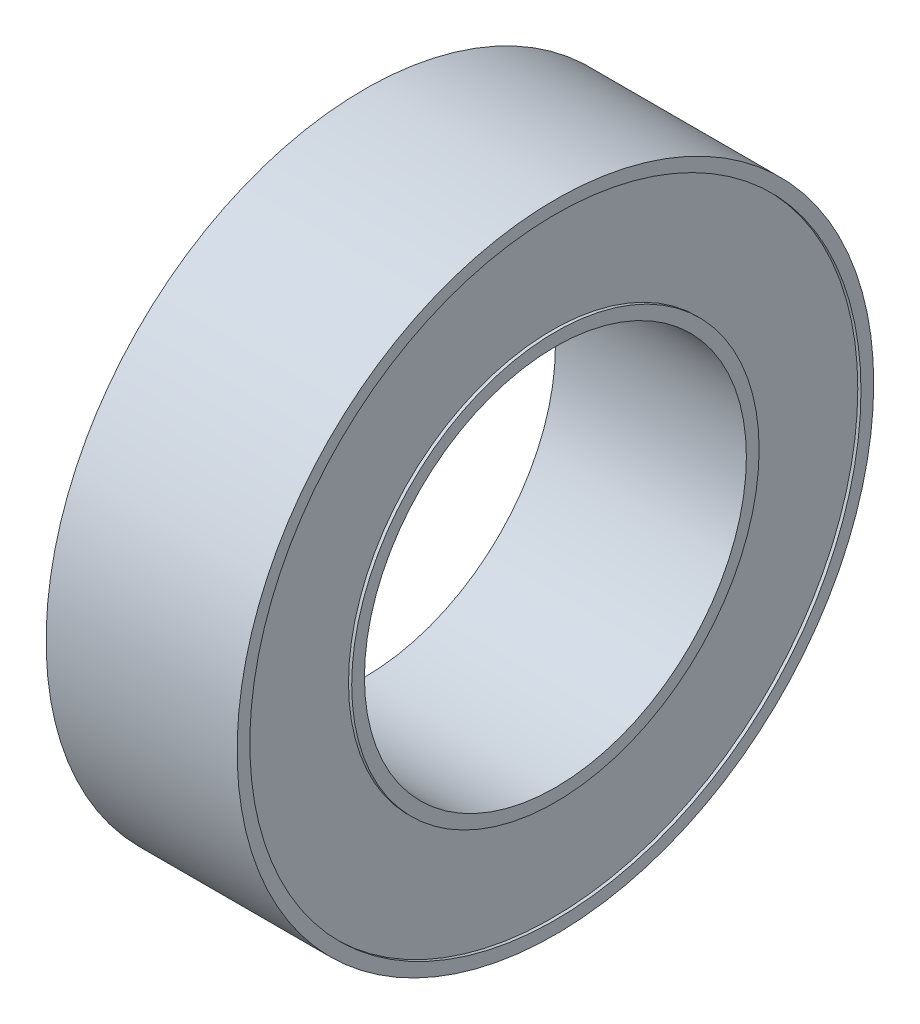
ISO-10303-21;
HEADER;
FILE_DESCRIPTION(('STEP AP214'),'2;1');
FILE_NAME('part.step','',(''),(''),'','','');
FILE_SCHEMA(('AUTOMOTIVE_DESIGN { 1 0 10303 214 1 1 1 1 }'));
ENDSEC;
DATA;
#1=APPLICATION_CONTEXT('core data for automotive mechanical design processes');
#2=APPLICATION_PROTOCOL_DEFINITION('international standard','automotive_design',2000,#1);
#3=PRODUCT_CONTEXT('',#1,'mechanical');
#4=PRODUCT('Part','Part','',(#3));
#5=PRODUCT_RELATED_PRODUCT_CATEGORY('part','',(#4));
#6=PRODUCT_DEFINITION_FORMATION('','',#4);
#7=PRODUCT_DEFINITION_CONTEXT('part definition',#1,'design');
#8=PRODUCT_DEFINITION('design','',#6,#7);
#9=PRODUCT_DEFINITION_SHAPE('','',#8);
#10=(LENGTH_UNIT() NAMED_UNIT(*) SI_UNIT(.MILLI.,.METRE.));
#11=(NAMED_UNIT(*) PLANE_ANGLE_UNIT() SI_UNIT($,.RADIAN.));
#12=(NAMED_UNIT(*) SI_UNIT($,.STERADIAN.) SOLID_ANGLE_UNIT());
#13=UNCERTAINTY_MEASURE_WITH_UNIT(LENGTH_MEASURE(1.E-05),#10,'distance_accuracy_value','');
#14=(GEOMETRIC_REPRESENTATION_CONTEXT(3) GLOBAL_UNCERTAINTY_ASSIGNED_CONTEXT((#13)) GLOBAL_UNIT_ASSIGNED_CONTEXT((#10,
#11,#12)) REPRESENTATION_CONTEXT('',''));
#15=CARTESIAN_POINT('',(0.,0.,0.));
#16=DIRECTION('',(0.,0.,1.));
#17=DIRECTION('',(1.,0.,0.));
#18=AXIS2_PLACEMENT_3D('',#15,#16,#17);
#19=CARTESIAN_POINT('',(-1.5,0.,0.));
#20=DIRECTION('',(1.,0.,0.));
#21=DIRECTION('',(0.,0.,-1.));
#22=AXIS2_PLACEMENT_3D('',#19,#20,#21);
#23=PLANE('',#22);
#24=CARTESIAN_POINT('',(-1.5,0.,0.));
#25=DIRECTION('',(1.,0.,0.));
#26=DIRECTION('',(0.,0.,-1.));
#27=AXIS2_PLACEMENT_3D('',#24,#25,#26);
#28=CIRCLE('',#27,3.);
#29=CARTESIAN_POINT('',(-1.5,0.,-3.));
#30=VERTEX_POINT('',#29);
#31=EDGE_CURVE('E56',#30,#30,#28,.T.);
#32=ORIENTED_EDGE('',*,*,#31,.T.);
#33=EDGE_LOOP('',(#32));
#34=FACE_BOUND('',#33,.T.);
#35=CARTESIAN_POINT('',(-1.5,0.,0.));
#36=DIRECTION('',(1.,0.,0.));
#37=DIRECTION('',(0.,0.,-1.));
#38=AXIS2_PLACEMENT_3D('',#35,#36,#37);
#39=CIRCLE('',#38,3.2);
#40=CARTESIAN_POINT('',(-1.5,0.,-3.2));
#41=VERTEX_POINT('',#40);
#42=EDGE_CURVE('E80',#41,#41,#39,.T.);
#43=ORIENTED_EDGE('',*,*,#42,.F.);
#44=EDGE_LOOP('',(#43));
#45=FACE_BOUND('',#44,.T.);
#46=ADVANCED_FACE('F43',(#34,#45),#23,.F.);
#47=CARTESIAN_POINT('',(1.5,0.,0.));
#48=DIRECTION('',(1.,0.,0.));
#49=DIRECTION('',(0.,0.,-1.));
#50=AXIS2_PLACEMENT_3D('',#47,#48,#49);
#51=PLANE('',#50);
#52=CARTESIAN_POINT('',(1.5,0.,0.));
#53=DIRECTION('',(1.,0.,0.));
#54=DIRECTION('',(0.,0.,-1.));
#55=AXIS2_PLACEMENT_3D('',#52,#53,#54);
#56=CIRCLE('',#55,3.);
#57=CARTESIAN_POINT('',(1.5,0.,-3.));
#58=VERTEX_POINT('',#57);
#59=EDGE_CURVE('E54',#58,#58,#56,.T.);
#60=ORIENTED_EDGE('',*,*,#59,.F.);
#61=EDGE_LOOP('',(#60));
#62=FACE_BOUND('',#61,.T.);
#63=CARTESIAN_POINT('',(1.5,0.,0.));
#64=DIRECTION('',(1.,0.,0.));
#65=DIRECTION('',(0.,0.,-1.));
#66=AXIS2_PLACEMENT_3D('',#63,#64,#65);
#67=CIRCLE('',#66,3.2);
#68=CARTESIAN_POINT('',(1.5,0.,-3.2));
#69=VERTEX_POINT('',#68);
#70=EDGE_CURVE('E68',#69,#69,#67,.T.);
#71=ORIENTED_EDGE('',*,*,#70,.T.);
#72=EDGE_LOOP('',(#71));
#73=FACE_BOUND('',#72,.T.);
#74=ADVANCED_FACE('F96',(#62,#73),#51,.T.);
#75=CARTESIAN_POINT('',(1.5,0.,0.));
#76=DIRECTION('',(1.,0.,0.));
#77=DIRECTION('',(0.,0.,-1.));
#78=AXIS2_PLACEMENT_3D('',#75,#76,#77);
#79=CIRCLE('',#78,4.8);
#80=CARTESIAN_POINT('',(1.5,0.,-4.8));
#81=VERTEX_POINT('',#80);
#82=EDGE_CURVE('E62',#81,#81,#79,.T.);
#83=ORIENTED_EDGE('',*,*,#82,.F.);
#84=EDGE_LOOP('',(#83));
#85=FACE_BOUND('',#84,.T.);
#86=CARTESIAN_POINT('',(1.5,0.,0.));
#87=DIRECTION('',(1.,0.,0.));
#88=DIRECTION('',(0.,0.,-1.));
#89=AXIS2_PLACEMENT_3D('',#86,#87,#88);
#90=CIRCLE('',#89,5.);
#91=CARTESIAN_POINT('',(1.5,0.,-5.));
#92=VERTEX_POINT('',#91);
#93=EDGE_CURVE('E10',#92,#92,#90,.T.);
#94=ORIENTED_EDGE('',*,*,#93,.T.);
#95=EDGE_LOOP('',(#94));
#96=FACE_BOUND('',#95,.T.);
#97=ADVANCED_FACE('F104',(#85,#96),#51,.T.);
#98=CARTESIAN_POINT('',(-1.5,0.,0.));
#99=DIRECTION('',(1.,0.,0.));
#100=DIRECTION('',(0.,0.,-1.));
#101=AXIS2_PLACEMENT_3D('',#98,#99,#100);
#102=CIRCLE('',#101,4.8);
#103=CARTESIAN_POINT('',(-1.5,0.,-4.8));
#104=VERTEX_POINT('',#103);
#105=EDGE_CURVE('E74',#104,#104,#102,.T.);
#106=ORIENTED_EDGE('',*,*,#105,.T.);
#107=EDGE_LOOP('',(#106));
#108=FACE_BOUND('',#107,.T.);
#109=CARTESIAN_POINT('',(-1.5,0.,0.));
#110=DIRECTION('',(1.,0.,0.));
#111=DIRECTION('',(0.,0.,-1.));
#112=AXIS2_PLACEMENT_3D('',#109,#110,#111);
#113=CIRCLE('',#112,5.);
#114=CARTESIAN_POINT('',(-1.5,0.,-5.));
#115=VERTEX_POINT('',#114);
#116=EDGE_CURVE('E47',#115,#115,#113,.T.);
#117=ORIENTED_EDGE('',*,*,#116,.F.);
#118=EDGE_LOOP('',(#117));
#119=FACE_BOUND('',#118,.T.);
#120=ADVANCED_FACE('F98',(#108,#119),#23,.F.);
#121=CARTESIAN_POINT('',(1.5,0.,0.));
#122=DIRECTION('',(-1.,0.,0.));
#123=DIRECTION('',(0.,0.,1.));
#124=AXIS2_PLACEMENT_3D('',#121,#122,#123);
#125=CYLINDRICAL_SURFACE('',#124,5.);
#126=ORIENTED_EDGE('',*,*,#93,.F.);
#127=EDGE_LOOP('',(#126));
#128=FACE_BOUND('',#127,.T.);
#129=ORIENTED_EDGE('',*,*,#116,.T.);
#130=EDGE_LOOP('',(#129));
#131=FACE_BOUND('',#130,.T.);
#132=ADVANCED_FACE('F45',(#128,#131),#125,.T.);
#133=CARTESIAN_POINT('',(1.5,0.,0.));
#134=DIRECTION('',(-1.,0.,0.));
#135=DIRECTION('',(0.,0.,1.));
#136=AXIS2_PLACEMENT_3D('',#133,#134,#135);
#137=CYLINDRICAL_SURFACE('',#136,3.);
#138=ORIENTED_EDGE('',*,*,#59,.T.);
#139=EDGE_LOOP('',(#138));
#140=FACE_BOUND('',#139,.T.);
#141=ORIENTED_EDGE('',*,*,#31,.F.);
#142=EDGE_LOOP('',(#141));
#143=FACE_BOUND('',#142,.T.);
#144=ADVANCED_FACE('F112',(#140,#143),#137,.F.);
#145=CARTESIAN_POINT('',(1.45,0.,0.));
#146=DIRECTION('',(1.,0.,0.));
#147=DIRECTION('',(0.,0.,-1.));
#148=AXIS2_PLACEMENT_3D('',#145,#146,#147);
#149=CYLINDRICAL_SURFACE('',#148,4.8);
#150=CARTESIAN_POINT('',(1.45,0.,0.));
#151=DIRECTION('',(1.,0.,0.));
#152=DIRECTION('',(0.,0.,-1.));
#153=AXIS2_PLACEMENT_3D('',#150,#151,#152);
#154=CIRCLE('',#153,4.8);
#155=CARTESIAN_POINT('',(1.45,0.,-4.8));
#156=VERTEX_POINT('',#155);
#157=EDGE_CURVE('E59',#156,#156,#154,.T.);
#158=ORIENTED_EDGE('',*,*,#157,.F.);
#159=EDGE_LOOP('',(#158));
#160=FACE_BOUND('',#159,.T.);
#161=ORIENTED_EDGE('',*,*,#82,.T.);
#162=EDGE_LOOP('',(#161));
#163=FACE_BOUND('',#162,.T.);
#164=ADVANCED_FACE('F136',(#160,#163),#149,.F.);
#165=CARTESIAN_POINT('',(1.45,0.,0.));
#166=DIRECTION('',(1.,0.,0.));
#167=DIRECTION('',(0.,0.,-1.));
#168=AXIS2_PLACEMENT_3D('',#165,#166,#167);
#169=PLANE('',#168);
#170=CARTESIAN_POINT('',(1.45,0.,0.));
#171=DIRECTION('',(1.,0.,0.));
#172=DIRECTION('',(0.,0.,-1.));
#173=AXIS2_PLACEMENT_3D('',#170,#171,#172);
#174=CIRCLE('',#173,3.2);
#175=CARTESIAN_POINT('',(1.45,0.,-3.2));
#176=VERTEX_POINT('',#175);
#177=EDGE_CURVE('E65',#176,#176,#174,.T.);
#178=ORIENTED_EDGE('',*,*,#177,.F.);
#179=EDGE_LOOP('',(#178));
#180=FACE_BOUND('',#179,.T.);
#181=ORIENTED_EDGE('',*,*,#157,.T.);
#182=EDGE_LOOP('',(#181));
#183=FACE_BOUND('',#182,.T.);
#184=ADVANCED_FACE('F132',(#180,#183),#169,.T.);
#185=CARTESIAN_POINT('',(1.45,0.,0.));
#186=DIRECTION('',(1.,0.,0.));
#187=DIRECTION('',(0.,0.,-1.));
#188=AXIS2_PLACEMENT_3D('',#185,#186,#187);
#189=CYLINDRICAL_SURFACE('',#188,3.2);
#190=ORIENTED_EDGE('',*,*,#177,.T.);
#191=EDGE_LOOP('',(#190));
#192=FACE_BOUND('',#191,.T.);
#193=ORIENTED_EDGE('',*,*,#70,.F.);
#194=EDGE_LOOP('',(#193));
#195=FACE_BOUND('',#194,.T.);
#196=ADVANCED_FACE('F127',(#192,#195),#189,.T.);
#197=CARTESIAN_POINT('',(-1.45,0.,0.));
#198=DIRECTION('',(-1.,0.,0.));
#199=DIRECTION('',(0.,0.,-1.));
#200=AXIS2_PLACEMENT_3D('',#197,#198,#199);
#201=PLANE('',#200);
#202=CARTESIAN_POINT('',(-1.45,0.,0.));
#203=DIRECTION('',(1.,0.,0.));
#204=DIRECTION('',(0.,0.,-1.));
#205=AXIS2_PLACEMENT_3D('',#202,#203,#204);
#206=CIRCLE('',#205,4.8);
#207=CARTESIAN_POINT('',(-1.45,0.,-4.8));
#208=VERTEX_POINT('',#207);
#209=EDGE_CURVE('E71',#208,#208,#206,.T.);
#210=ORIENTED_EDGE('',*,*,#209,.F.);
#211=EDGE_LOOP('',(#210));
#212=FACE_BOUND('',#211,.T.);
#213=CARTESIAN_POINT('',(-1.45,0.,0.));
#214=DIRECTION('',(1.,0.,0.));
#215=DIRECTION('',(0.,0.,-1.));
#216=AXIS2_PLACEMENT_3D('',#213,#214,#215);
#217=CIRCLE('',#216,3.2);
#218=CARTESIAN_POINT('',(-1.45,0.,-3.2));
#219=VERTEX_POINT('',#218);
#220=EDGE_CURVE('E77',#219,#219,#217,.T.);
#221=ORIENTED_EDGE('',*,*,#220,.T.);
#222=EDGE_LOOP('',(#221));
#223=FACE_BOUND('',#222,.T.);
#224=ADVANCED_FACE('F86',(#212,#223),#201,.T.);
#225=CARTESIAN_POINT('',(-1.45,0.,0.));
#226=DIRECTION('',(-1.,0.,0.));
#227=DIRECTION('',(0.,0.,1.));
#228=AXIS2_PLACEMENT_3D('',#225,#226,#227);
#229=CYLINDRICAL_SURFACE('',#228,4.8);
#230=ORIENTED_EDGE('',*,*,#209,.T.);
#231=EDGE_LOOP('',(#230));
#232=FACE_BOUND('',#231,.T.);
#233=ORIENTED_EDGE('',*,*,#105,.F.);
#234=EDGE_LOOP('',(#233));
#235=FACE_BOUND('',#234,.T.);
#236=ADVANCED_FACE('F91',(#232,#235),#229,.F.);
#237=CARTESIAN_POINT('',(-1.45,0.,0.));
#238=DIRECTION('',(-1.,0.,0.));
#239=DIRECTION('',(0.,0.,1.));
#240=AXIS2_PLACEMENT_3D('',#237,#238,#239);
#241=CYLINDRICAL_SURFACE('',#240,3.2);
#242=ORIENTED_EDGE('',*,*,#220,.F.);
#243=EDGE_LOOP('',(#242));
#244=FACE_BOUND('',#243,.T.);
#245=ORIENTED_EDGE('',*,*,#42,.T.);
#246=EDGE_LOOP('',(#245));
#247=FACE_BOUND('',#246,.T.);
#248=ADVANCED_FACE('F88',(#244,#247),#241,.T.);
#249=CLOSED_SHELL('',(#46,#74,#97,#120,#132,#144,#164,#184,#196,#224,#236,#248));
#250=MANIFOLD_SOLID_BREP('B2',#249);
#251=ADVANCED_BREP_SHAPE_REPRESENTATION('',(#18,#250),#14);
#252=SHAPE_DEFINITION_REPRESENTATION(#9,#251);
ENDSEC;
END-ISO-10303-21;
